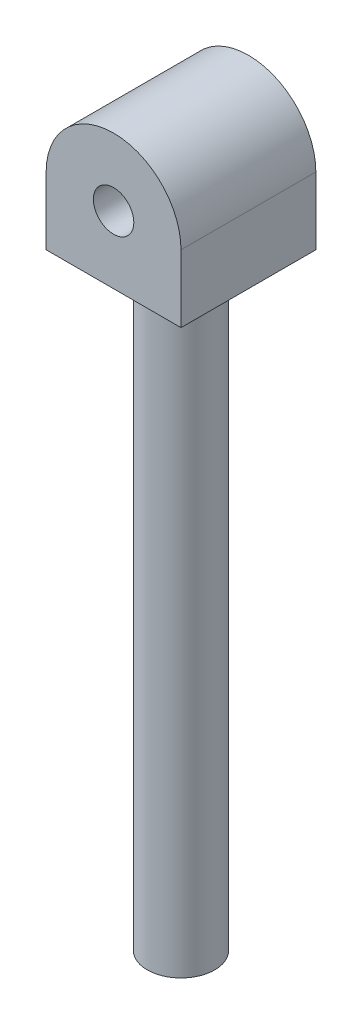
ISO-10303-21;
HEADER;
FILE_DESCRIPTION(('STEP AP214'),'2;1');
FILE_NAME('part.step','',(''),(''),'','','');
FILE_SCHEMA(('AUTOMOTIVE_DESIGN { 1 0 10303 214 1 1 1 1 }'));
ENDSEC;
DATA;
#1=APPLICATION_CONTEXT('core data for automotive mechanical design processes');
#2=APPLICATION_PROTOCOL_DEFINITION('international standard','automotive_design',2000,#1);
#3=PRODUCT_CONTEXT('',#1,'mechanical');
#4=PRODUCT('Part','Part','',(#3));
#5=PRODUCT_RELATED_PRODUCT_CATEGORY('part','',(#4));
#6=PRODUCT_DEFINITION_FORMATION('','',#4);
#7=PRODUCT_DEFINITION_CONTEXT('part definition',#1,'design');
#8=PRODUCT_DEFINITION('design','',#6,#7);
#9=PRODUCT_DEFINITION_SHAPE('','',#8);
#10=(LENGTH_UNIT() NAMED_UNIT(*) SI_UNIT(.MILLI.,.METRE.));
#11=(NAMED_UNIT(*) PLANE_ANGLE_UNIT() SI_UNIT($,.RADIAN.));
#12=(NAMED_UNIT(*) SI_UNIT($,.STERADIAN.) SOLID_ANGLE_UNIT());
#13=UNCERTAINTY_MEASURE_WITH_UNIT(LENGTH_MEASURE(1.E-05),#10,'distance_accuracy_value','');
#14=(GEOMETRIC_REPRESENTATION_CONTEXT(3) GLOBAL_UNCERTAINTY_ASSIGNED_CONTEXT((#13)) GLOBAL_UNIT_ASSIGNED_CONTEXT((#10,
#11,#12)) REPRESENTATION_CONTEXT('',''));
#15=CARTESIAN_POINT('',(0.,0.,0.));
#16=DIRECTION('',(0.,0.,1.));
#17=DIRECTION('',(1.,0.,0.));
#18=AXIS2_PLACEMENT_3D('',#15,#16,#17);
#19=CARTESIAN_POINT('',(-5.,-5.,10.));
#20=DIRECTION('',(0.,1.,0.));
#21=DIRECTION('',(0.,0.,1.));
#22=AXIS2_PLACEMENT_3D('',#19,#20,#21);
#23=PLANE('',#22);
#24=DIRECTION('',(1.,0.,0.));
#25=VECTOR('',#24,1.);
#26=CARTESIAN_POINT('',(-5.,-5.,0.));
#27=LINE('',#26,#25);
#28=CARTESIAN_POINT('',(-5.,-5.,0.));
#29=VERTEX_POINT('',#28);
#30=CARTESIAN_POINT('',(5.,-5.,0.));
#31=VERTEX_POINT('',#30);
#32=EDGE_CURVE('E67',#29,#31,#27,.T.);
#33=ORIENTED_EDGE('',*,*,#32,.T.);
#34=DIRECTION('',(0.,0.,-1.));
#35=VECTOR('',#34,1.);
#36=CARTESIAN_POINT('',(5.,-5.,10.));
#37=LINE('',#36,#35);
#38=CARTESIAN_POINT('',(5.,-5.,10.));
#39=VERTEX_POINT('',#38);
#40=EDGE_CURVE('E93',#39,#31,#37,.T.);
#41=ORIENTED_EDGE('',*,*,#40,.F.);
#42=DIRECTION('',(1.,0.,0.));
#43=VECTOR('',#42,1.);
#44=CARTESIAN_POINT('',(-5.,-5.,10.));
#45=LINE('',#44,#43);
#46=CARTESIAN_POINT('',(-5.,-5.,10.));
#47=VERTEX_POINT('',#46);
#48=EDGE_CURVE('E85',#47,#39,#45,.T.);
#49=ORIENTED_EDGE('',*,*,#48,.F.);
#50=DIRECTION('',(0.,0.,-1.));
#51=VECTOR('',#50,1.);
#52=CARTESIAN_POINT('',(-5.,-5.,10.));
#53=LINE('',#52,#51);
#54=EDGE_CURVE('E90',#47,#29,#53,.T.);
#55=ORIENTED_EDGE('',*,*,#54,.T.);
#56=EDGE_LOOP('',(#33,#41,#49,#55));
#57=FACE_BOUND('',#56,.T.);
#58=CARTESIAN_POINT('',(0.,-5.,5.));
#59=DIRECTION('',(0.,1.,0.));
#60=DIRECTION('',(0.,0.,1.));
#61=AXIS2_PLACEMENT_3D('',#58,#59,#60);
#62=CIRCLE('',#61,2.5);
#63=CARTESIAN_POINT('',(0.,-5.,7.5));
#64=VERTEX_POINT('',#63);
#65=EDGE_CURVE('E11',#64,#64,#62,.F.);
#66=ORIENTED_EDGE('',*,*,#65,.F.);
#67=EDGE_LOOP('',(#66));
#68=FACE_BOUND('',#67,.T.);
#69=ADVANCED_FACE('F33',(#57,#68),#23,.F.);
#70=CARTESIAN_POINT('',(0.,0.,10.));
#71=DIRECTION('',(0.,0.,1.));
#72=DIRECTION('',(1.,0.,0.));
#73=AXIS2_PLACEMENT_3D('',#70,#71,#72);
#74=PLANE('',#73);
#75=CARTESIAN_POINT('',(0.,0.,10.));
#76=DIRECTION('',(0.,0.,1.));
#77=DIRECTION('',(1.,0.,0.));
#78=AXIS2_PLACEMENT_3D('',#75,#76,#77);
#79=CIRCLE('',#78,5.);
#80=CARTESIAN_POINT('',(5.,0.,10.));
#81=VERTEX_POINT('',#80);
#82=CARTESIAN_POINT('',(-5.,0.,10.));
#83=VERTEX_POINT('',#82);
#84=EDGE_CURVE('E87',#81,#83,#79,.T.);
#85=ORIENTED_EDGE('',*,*,#84,.T.);
#86=DIRECTION('',(0.,-1.,0.));
#87=VECTOR('',#86,1.);
#88=CARTESIAN_POINT('',(-5.,0.,10.));
#89=LINE('',#88,#87);
#90=EDGE_CURVE('E81',#83,#47,#89,.T.);
#91=ORIENTED_EDGE('',*,*,#90,.T.);
#92=ORIENTED_EDGE('',*,*,#48,.T.);
#93=DIRECTION('',(0.,1.,0.));
#94=VECTOR('',#93,1.);
#95=CARTESIAN_POINT('',(5.,-5.,10.));
#96=LINE('',#95,#94);
#97=EDGE_CURVE('E50',#39,#81,#96,.T.);
#98=ORIENTED_EDGE('',*,*,#97,.T.);
#99=EDGE_LOOP('',(#85,#91,#92,#98));
#100=FACE_BOUND('',#99,.T.);
#101=CARTESIAN_POINT('',(0.,0.,10.));
#102=DIRECTION('',(0.,0.,1.));
#103=DIRECTION('',(1.,0.,0.));
#104=AXIS2_PLACEMENT_3D('',#101,#102,#103);
#105=CIRCLE('',#104,1.5);
#106=CARTESIAN_POINT('',(1.5,0.,10.));
#107=VERTEX_POINT('',#106);
#108=EDGE_CURVE('E104',#107,#107,#105,.T.);
#109=ORIENTED_EDGE('',*,*,#108,.F.);
#110=EDGE_LOOP('',(#109));
#111=FACE_BOUND('',#110,.T.);
#112=ADVANCED_FACE('F82',(#100,#111),#74,.T.);
#113=CARTESIAN_POINT('',(0.,0.,0.));
#114=DIRECTION('',(0.,0.,1.));
#115=DIRECTION('',(1.,0.,0.));
#116=AXIS2_PLACEMENT_3D('',#113,#114,#115);
#117=PLANE('',#116);
#118=CARTESIAN_POINT('',(0.,0.,0.));
#119=DIRECTION('',(0.,0.,1.));
#120=DIRECTION('',(1.,0.,0.));
#121=AXIS2_PLACEMENT_3D('',#118,#119,#120);
#122=CIRCLE('',#121,5.);
#123=CARTESIAN_POINT('',(5.,0.,0.));
#124=VERTEX_POINT('',#123);
#125=CARTESIAN_POINT('',(-5.,0.,0.));
#126=VERTEX_POINT('',#125);
#127=EDGE_CURVE('E101',#124,#126,#122,.T.);
#128=ORIENTED_EDGE('',*,*,#127,.F.);
#129=DIRECTION('',(0.,1.,0.));
#130=VECTOR('',#129,1.);
#131=CARTESIAN_POINT('',(5.,-5.,0.));
#132=LINE('',#131,#130);
#133=EDGE_CURVE('E73',#31,#124,#132,.T.);
#134=ORIENTED_EDGE('',*,*,#133,.F.);
#135=ORIENTED_EDGE('',*,*,#32,.F.);
#136=DIRECTION('',(0.,-1.,0.));
#137=VECTOR('',#136,1.);
#138=CARTESIAN_POINT('',(-5.,0.,0.));
#139=LINE('',#138,#137);
#140=EDGE_CURVE('E92',#126,#29,#139,.T.);
#141=ORIENTED_EDGE('',*,*,#140,.F.);
#142=EDGE_LOOP('',(#128,#134,#135,#141));
#143=FACE_BOUND('',#142,.T.);
#144=CARTESIAN_POINT('',(0.,0.,0.));
#145=DIRECTION('',(0.,0.,1.));
#146=DIRECTION('',(1.,0.,0.));
#147=AXIS2_PLACEMENT_3D('',#144,#145,#146);
#148=CIRCLE('',#147,1.5);
#149=CARTESIAN_POINT('',(1.5,0.,0.));
#150=VERTEX_POINT('',#149);
#151=EDGE_CURVE('E118',#150,#150,#148,.T.);
#152=ORIENTED_EDGE('',*,*,#151,.T.);
#153=EDGE_LOOP('',(#152));
#154=FACE_BOUND('',#153,.T.);
#155=ADVANCED_FACE('F112',(#143,#154),#117,.F.);
#156=CARTESIAN_POINT('',(0.,0.,10.));
#157=DIRECTION('',(0.,0.,-1.));
#158=DIRECTION('',(-1.,0.,0.));
#159=AXIS2_PLACEMENT_3D('',#156,#157,#158);
#160=CYLINDRICAL_SURFACE('',#159,5.);
#161=ORIENTED_EDGE('',*,*,#127,.T.);
#162=DIRECTION('',(0.,0.,-1.));
#163=VECTOR('',#162,1.);
#164=CARTESIAN_POINT('',(-5.,0.,10.));
#165=LINE('',#164,#163);
#166=EDGE_CURVE('E42',#83,#126,#165,.T.);
#167=ORIENTED_EDGE('',*,*,#166,.F.);
#168=ORIENTED_EDGE('',*,*,#84,.F.);
#169=DIRECTION('',(0.,0.,-1.));
#170=VECTOR('',#169,1.);
#171=CARTESIAN_POINT('',(5.,0.,10.));
#172=LINE('',#171,#170);
#173=EDGE_CURVE('E97',#81,#124,#172,.T.);
#174=ORIENTED_EDGE('',*,*,#173,.T.);
#175=EDGE_LOOP('',(#161,#167,#168,#174));
#176=FACE_BOUND('',#175,.T.);
#177=ADVANCED_FACE('F35',(#176),#160,.T.);
#178=CARTESIAN_POINT('',(-5.,0.,10.));
#179=DIRECTION('',(1.,0.,0.));
#180=DIRECTION('',(0.,1.,0.));
#181=AXIS2_PLACEMENT_3D('',#178,#179,#180);
#182=PLANE('',#181);
#183=ORIENTED_EDGE('',*,*,#140,.T.);
#184=ORIENTED_EDGE('',*,*,#54,.F.);
#185=ORIENTED_EDGE('',*,*,#90,.F.);
#186=ORIENTED_EDGE('',*,*,#166,.T.);
#187=EDGE_LOOP('',(#183,#184,#185,#186));
#188=FACE_BOUND('',#187,.T.);
#189=ADVANCED_FACE('F91',(#188),#182,.F.);
#190=CARTESIAN_POINT('',(5.,-5.,10.));
#191=DIRECTION('',(-1.,0.,0.));
#192=DIRECTION('',(0.,-1.,0.));
#193=AXIS2_PLACEMENT_3D('',#190,#191,#192);
#194=PLANE('',#193);
#195=ORIENTED_EDGE('',*,*,#133,.T.);
#196=ORIENTED_EDGE('',*,*,#173,.F.);
#197=ORIENTED_EDGE('',*,*,#97,.F.);
#198=ORIENTED_EDGE('',*,*,#40,.T.);
#199=EDGE_LOOP('',(#195,#196,#197,#198));
#200=FACE_BOUND('',#199,.T.);
#201=ADVANCED_FACE('F143',(#200),#194,.F.);
#202=CARTESIAN_POINT('',(0.,0.,10.));
#203=DIRECTION('',(0.,0.,-1.));
#204=DIRECTION('',(-1.,0.,0.));
#205=AXIS2_PLACEMENT_3D('',#202,#203,#204);
#206=CYLINDRICAL_SURFACE('',#205,1.5);
#207=ORIENTED_EDGE('',*,*,#108,.T.);
#208=EDGE_LOOP('',(#207));
#209=FACE_BOUND('',#208,.T.);
#210=ORIENTED_EDGE('',*,*,#151,.F.);
#211=EDGE_LOOP('',(#210));
#212=FACE_BOUND('',#211,.T.);
#213=ADVANCED_FACE('F133',(#209,#212),#206,.F.);
#214=CARTESIAN_POINT('',(0.,-50.,5.));
#215=DIRECTION('',(0.,1.,0.));
#216=DIRECTION('',(0.,0.,1.));
#217=AXIS2_PLACEMENT_3D('',#214,#215,#216);
#218=CYLINDRICAL_SURFACE('',#217,2.5);
#219=CARTESIAN_POINT('',(0.,-50.,5.));
#220=DIRECTION('',(0.,-1.,0.));
#221=DIRECTION('',(0.,0.,-1.));
#222=AXIS2_PLACEMENT_3D('',#219,#220,#221);
#223=CIRCLE('',#222,2.5);
#224=CARTESIAN_POINT('',(0.,-50.,7.5));
#225=VERTEX_POINT('',#224);
#226=EDGE_CURVE('E120',#225,#225,#223,.T.);
#227=CARTESIAN_POINT('',(0.,-50.,7.5));
#228=CARTESIAN_POINT('',(0.,-49.53125,7.5));
#229=CARTESIAN_POINT('',(0.,-49.0625,7.5));
#230=CARTESIAN_POINT('',(0.,-48.125,7.5));
#231=CARTESIAN_POINT('',(0.,-47.65625,7.5));
#232=CARTESIAN_POINT('',(0.,-46.71875,7.5));
#233=CARTESIAN_POINT('',(0.,-46.25,7.5));
#234=CARTESIAN_POINT('',(0.,-45.3125,7.5));
#235=CARTESIAN_POINT('',(0.,-44.84375,7.5));
#236=CARTESIAN_POINT('',(0.,-43.90625,7.5));
#237=CARTESIAN_POINT('',(0.,-43.4375,7.5));
#238=CARTESIAN_POINT('',(0.,-42.5,7.5));
#239=CARTESIAN_POINT('',(0.,-42.03125,7.5));
#240=CARTESIAN_POINT('',(0.,-41.09375,7.5));
#241=CARTESIAN_POINT('',(0.,-40.625,7.5));
#242=CARTESIAN_POINT('',(0.,-39.6875,7.5));
#243=CARTESIAN_POINT('',(0.,-39.21875,7.5));
#244=CARTESIAN_POINT('',(0.,-38.28125,7.5));
#245=CARTESIAN_POINT('',(0.,-37.8125,7.5));
#246=CARTESIAN_POINT('',(0.,-36.875,7.5));
#247=CARTESIAN_POINT('',(0.,-36.40625,7.5));
#248=CARTESIAN_POINT('',(0.,-35.46875,7.5));
#249=CARTESIAN_POINT('',(0.,-35.,7.5));
#250=CARTESIAN_POINT('',(0.,-34.0625,7.5));
#251=CARTESIAN_POINT('',(0.,-33.59375,7.5));
#252=CARTESIAN_POINT('',(0.,-32.65625,7.5));
#253=CARTESIAN_POINT('',(0.,-32.1875,7.5));
#254=CARTESIAN_POINT('',(0.,-31.25,7.5));
#255=CARTESIAN_POINT('',(0.,-30.78125,7.5));
#256=CARTESIAN_POINT('',(0.,-29.84375,7.5));
#257=CARTESIAN_POINT('',(0.,-29.375,7.5));
#258=CARTESIAN_POINT('',(0.,-28.4375,7.5));
#259=CARTESIAN_POINT('',(0.,-27.96875,7.5));
#260=CARTESIAN_POINT('',(0.,-27.03125,7.5));
#261=CARTESIAN_POINT('',(0.,-26.5625,7.5));
#262=CARTESIAN_POINT('',(0.,-25.625,7.5));
#263=CARTESIAN_POINT('',(0.,-25.15625,7.5));
#264=CARTESIAN_POINT('',(0.,-24.21875,7.5));
#265=CARTESIAN_POINT('',(0.,-23.75,7.5));
#266=CARTESIAN_POINT('',(0.,-22.8125,7.5));
#267=CARTESIAN_POINT('',(0.,-22.34375,7.5));
#268=CARTESIAN_POINT('',(0.,-21.40625,7.5));
#269=CARTESIAN_POINT('',(0.,-20.9375,7.5));
#270=CARTESIAN_POINT('',(0.,-20.,7.5));
#271=CARTESIAN_POINT('',(0.,-19.53125,7.5));
#272=CARTESIAN_POINT('',(0.,-18.59375,7.5));
#273=CARTESIAN_POINT('',(0.,-18.125,7.5));
#274=CARTESIAN_POINT('',(0.,-17.1875,7.5));
#275=CARTESIAN_POINT('',(0.,-16.71875,7.5));
#276=CARTESIAN_POINT('',(0.,-15.78125,7.5));
#277=CARTESIAN_POINT('',(0.,-15.3125,7.5));
#278=CARTESIAN_POINT('',(0.,-14.375,7.5));
#279=CARTESIAN_POINT('',(0.,-13.90625,7.5));
#280=CARTESIAN_POINT('',(0.,-12.96875,7.5));
#281=CARTESIAN_POINT('',(0.,-12.5,7.5));
#282=CARTESIAN_POINT('',(0.,-11.5625,7.5));
#283=CARTESIAN_POINT('',(0.,-11.09375,7.5));
#284=CARTESIAN_POINT('',(0.,-10.15625,7.5));
#285=CARTESIAN_POINT('',(0.,-9.6875,7.5));
#286=CARTESIAN_POINT('',(0.,-8.75000000000001,7.5));
#287=CARTESIAN_POINT('',(0.,-8.28125000000001,7.5));
#288=CARTESIAN_POINT('',(0.,-7.34375000000001,7.5));
#289=CARTESIAN_POINT('',(0.,-6.875,7.5));
#290=CARTESIAN_POINT('',(0.,-5.9375,7.5));
#291=CARTESIAN_POINT('',(0.,-5.46875,7.5));
#292=CARTESIAN_POINT('',(0.,-5.,7.5));
#293=B_SPLINE_CURVE_WITH_KNOTS('',3,(#227,#228,#229,#230,#231,#232,#233,#234,#235,#236,#237,
#238,#239,#240,#241,#242,#243,#244,#245,#246,#247,#248,#249,#250,#251,#252,#253,#254,#255,#256,
#257,#258,#259,#260,#261,#262,#263,#264,#265,#266,#267,#268,#269,#270,#271,#272,#273,#274,#275,
#276,#277,#278,#279,#280,#281,#282,#283,#284,#285,#286,#287,#288,#289,#290,#291,#292),
.UNSPECIFIED.,.F.,.F.,(4,2,2,2,2,2,2,2,2,2,2,2,2,2,2,2,2,2,2,2,2,2,2,2,2,2,2,2,2,2,2,2,4),(0.,
1.40625,2.8125,4.21874999999999,5.62499999999999,7.03125,8.43749999999999,9.84374999999999,
11.25,12.65625,14.0625,15.46875,16.875,18.28125,19.6875,21.09375,22.5,23.90625,25.3125,26.71875,
28.125,29.53125,30.9375,32.34375,33.75,35.15625,36.5625,37.96875,39.375,40.78125,42.1875,
43.59375,45.),.UNSPECIFIED.);
#294=EDGE_CURVE('BSEAM130',#225,#64,#293,.T.);
#295=ORIENTED_EDGE('',*,*,#226,.F.);
#296=ORIENTED_EDGE('',*,*,#65,.T.);
#297=ORIENTED_EDGE('',*,*,#294,.T.);
#298=ORIENTED_EDGE('',*,*,#294,.F.);
#299=EDGE_LOOP('',(#295,#297,#296,#298));
#300=FACE_BOUND('',#299,.T.);
#301=ADVANCED_FACE('F130',(#300),#218,.T.);
#302=CARTESIAN_POINT('',(0.,-50.,5.));
#303=DIRECTION('',(0.,-1.,0.));
#304=DIRECTION('',(0.,0.,-1.));
#305=AXIS2_PLACEMENT_3D('',#302,#303,#304);
#306=PLANE('',#305);
#307=ORIENTED_EDGE('',*,*,#226,.T.);
#308=EDGE_LOOP('',(#307));
#309=FACE_BOUND('',#308,.T.);
#310=ADVANCED_FACE('F128',(#309),#306,.T.);
#311=CLOSED_SHELL('',(#69,#112,#155,#177,#189,#201,#213,#301,#310));
#312=MANIFOLD_SOLID_BREP('B2',#311);
#313=ADVANCED_BREP_SHAPE_REPRESENTATION('',(#18,#312),#14);
#314=SHAPE_DEFINITION_REPRESENTATION(#9,#313);
ENDSEC;
END-ISO-10303-21;
